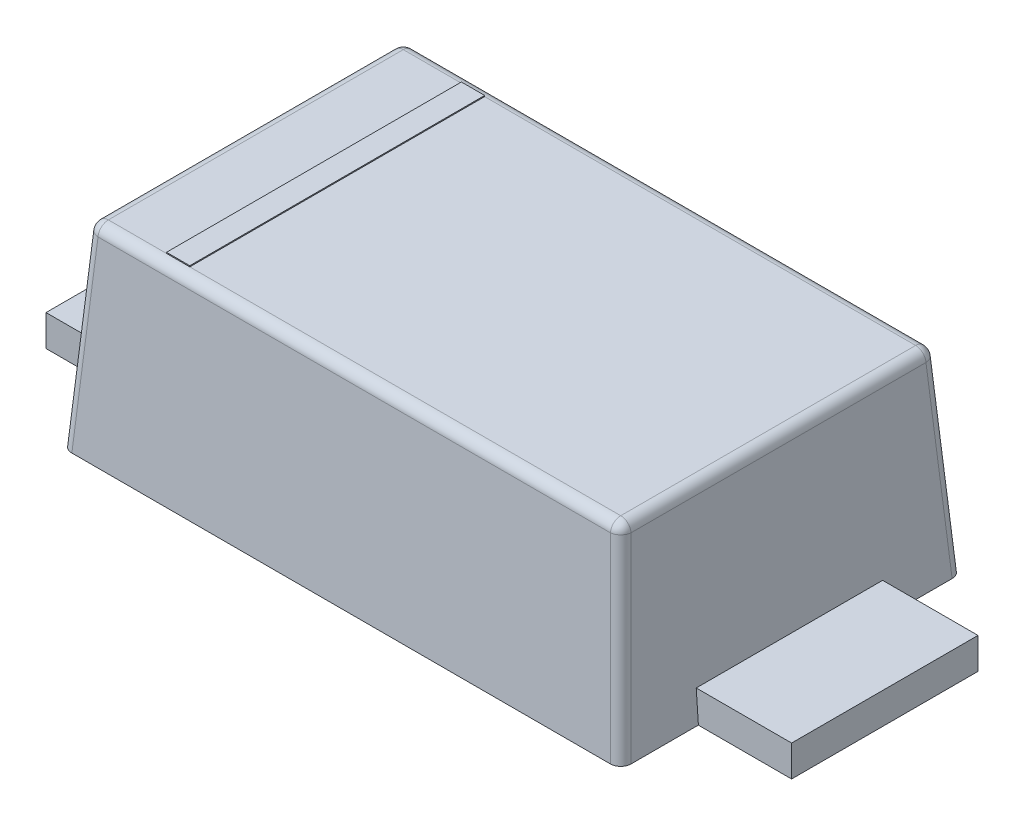
ISO-10303-21;
HEADER;
FILE_DESCRIPTION(('STEP AP214'),'2;1');
FILE_NAME('part.step','',(''),(''),'','','');
FILE_SCHEMA(('AUTOMOTIVE_DESIGN { 1 0 10303 214 1 1 1 1 }'));
ENDSEC;
DATA;
#1=APPLICATION_CONTEXT('core data for automotive mechanical design processes');
#2=APPLICATION_PROTOCOL_DEFINITION('international standard','automotive_design',2000,#1);
#3=PRODUCT_CONTEXT('',#1,'mechanical');
#4=PRODUCT('Part','Part','',(#3));
#5=PRODUCT_RELATED_PRODUCT_CATEGORY('part','',(#4));
#6=PRODUCT_DEFINITION_FORMATION('','',#4);
#7=PRODUCT_DEFINITION_CONTEXT('part definition',#1,'design');
#8=PRODUCT_DEFINITION('design','',#6,#7);
#9=PRODUCT_DEFINITION_SHAPE('','',#8);
#10=(LENGTH_UNIT() NAMED_UNIT(*) SI_UNIT(.MILLI.,.METRE.));
#11=(NAMED_UNIT(*) PLANE_ANGLE_UNIT() SI_UNIT($,.RADIAN.));
#12=(NAMED_UNIT(*) SI_UNIT($,.STERADIAN.) SOLID_ANGLE_UNIT());
#13=UNCERTAINTY_MEASURE_WITH_UNIT(LENGTH_MEASURE(1.E-05),#10,'distance_accuracy_value','');
#14=(GEOMETRIC_REPRESENTATION_CONTEXT(3) GLOBAL_UNCERTAINTY_ASSIGNED_CONTEXT((#13)) GLOBAL_UNIT_ASSIGNED_CONTEXT((#10,
#11,#12)) REPRESENTATION_CONTEXT('',''));
#15=CARTESIAN_POINT('',(0.,0.,0.));
#16=DIRECTION('',(0.,0.,1.));
#17=DIRECTION('',(1.,0.,0.));
#18=AXIS2_PLACEMENT_3D('',#15,#16,#17);
#19=CARTESIAN_POINT('',(0.,0.,0.));
#20=DIRECTION('',(0.,-1.,0.));
#21=DIRECTION('',(0.,0.,-1.));
#22=AXIS2_PLACEMENT_3D('',#19,#20,#21);
#23=PLANE('',#22);
#24=DIRECTION('',(0.,0.,-1.));
#25=VECTOR('',#24,1.);
#26=CARTESIAN_POINT('',(1.05,0.,-0.45));
#27=LINE('',#26,#25);
#28=CARTESIAN_POINT('',(1.05,0.,0.45));
#29=VERTEX_POINT('',#28);
#30=CARTESIAN_POINT('',(1.05,0.,-0.45));
#31=VERTEX_POINT('',#30);
#32=EDGE_CURVE('E56',#29,#31,#27,.T.);
#33=ORIENTED_EDGE('',*,*,#32,.F.);
#34=DIRECTION('',(-1.,0.,0.));
#35=VECTOR('',#34,1.);
#36=CARTESIAN_POINT('',(1.05,0.,0.45));
#37=LINE('',#36,#35);
#38=CARTESIAN_POINT('',(1.35000000000001,0.,0.45));
#39=VERTEX_POINT('',#38);
#40=EDGE_CURVE('E252',#39,#29,#37,.T.);
#41=ORIENTED_EDGE('',*,*,#40,.F.);
#42=DIRECTION('',(0.,0.,-1.));
#43=VECTOR('',#42,1.);
#44=CARTESIAN_POINT('',(1.35000000000001,0.,0.824999999999999));
#45=LINE('',#44,#43);
#46=CARTESIAN_POINT('',(1.35000000000001,0.,0.775121797487008));
#47=VERTEX_POINT('',#46);
#48=EDGE_CURVE('E389',#47,#39,#45,.T.);
#49=ORIENTED_EDGE('',*,*,#48,.F.);
#50=CARTESIAN_POINT('',(1.29987790509595,0.,0.774877905095941));
#51=DIRECTION('',(0.,-1.,0.));
#52=DIRECTION('',(0.707106781186548,0.,0.707106781186548));
#53=AXIS2_PLACEMENT_3D('',#50,#51,#52);
#54=ELLIPSE('',#53,0.0502438931129238,0.05);
#55=CARTESIAN_POINT('',(1.30012179748702,0.,0.824999999999999));
#56=VERTEX_POINT('',#55);
#57=EDGE_CURVE('E411',#47,#56,#54,.T.);
#58=ORIENTED_EDGE('',*,*,#57,.T.);
#59=DIRECTION('',(1.,0.,0.));
#60=VECTOR('',#59,1.);
#61=CARTESIAN_POINT('',(-1.35,0.,0.824999999999999));
#62=LINE('',#61,#60);
#63=CARTESIAN_POINT('',(-1.30012179748701,0.,0.824999999999999));
#64=VERTEX_POINT('',#63);
#65=EDGE_CURVE('E393',#64,#56,#62,.T.);
#66=ORIENTED_EDGE('',*,*,#65,.F.);
#67=CARTESIAN_POINT('',(-1.29987790509595,0.,0.774877905095941));
#68=DIRECTION('',(0.,-1.,0.));
#69=DIRECTION('',(-0.707106781186548,0.,0.707106781186548));
#70=AXIS2_PLACEMENT_3D('',#67,#68,#69);
#71=ELLIPSE('',#70,0.0502438931129238,0.05);
#72=CARTESIAN_POINT('',(-1.35,0.,0.775121797487008));
#73=VERTEX_POINT('',#72);
#74=EDGE_CURVE('E414',#64,#73,#71,.T.);
#75=ORIENTED_EDGE('',*,*,#74,.T.);
#76=DIRECTION('',(0.,0.,-1.));
#77=VECTOR('',#76,1.);
#78=CARTESIAN_POINT('',(-1.35,0.,0.824999999999999));
#79=LINE('',#78,#77);
#80=CARTESIAN_POINT('',(-1.35,0.,0.45));
#81=VERTEX_POINT('',#80);
#82=EDGE_CURVE('E379',#73,#81,#79,.T.);
#83=ORIENTED_EDGE('',*,*,#82,.T.);
#84=DIRECTION('',(-1.,0.,0.));
#85=VECTOR('',#84,1.);
#86=CARTESIAN_POINT('',(-1.05,0.,0.45));
#87=LINE('',#86,#85);
#88=CARTESIAN_POINT('',(-1.05,0.,0.45));
#89=VERTEX_POINT('',#88);
#90=EDGE_CURVE('E268',#89,#81,#87,.T.);
#91=ORIENTED_EDGE('',*,*,#90,.F.);
#92=DIRECTION('',(0.,0.,1.));
#93=VECTOR('',#92,1.);
#94=CARTESIAN_POINT('',(-1.05,0.,-0.45));
#95=LINE('',#94,#93);
#96=CARTESIAN_POINT('',(-1.05,0.,-0.45));
#97=VERTEX_POINT('',#96);
#98=EDGE_CURVE('E262',#97,#89,#95,.T.);
#99=ORIENTED_EDGE('',*,*,#98,.F.);
#100=DIRECTION('',(1.,0.,0.));
#101=VECTOR('',#100,1.);
#102=CARTESIAN_POINT('',(-1.05,0.,-0.45));
#103=LINE('',#102,#101);
#104=CARTESIAN_POINT('',(-1.35,0.,-0.45));
#105=VERTEX_POINT('',#104);
#106=EDGE_CURVE('E11',#105,#97,#103,.T.);
#107=ORIENTED_EDGE('',*,*,#106,.F.);
#108=CARTESIAN_POINT('',(-1.35,0.,-0.775121797487001));
#109=VERTEX_POINT('',#108);
#110=EDGE_CURVE('E384',#105,#109,#79,.T.);
#111=ORIENTED_EDGE('',*,*,#110,.T.);
#112=CARTESIAN_POINT('',(-1.29987790509595,0.,-0.774877905095934));
#113=DIRECTION('',(0.,-1.,0.));
#114=DIRECTION('',(-0.707106781186548,0.,-0.707106781186548));
#115=AXIS2_PLACEMENT_3D('',#112,#113,#114);
#116=ELLIPSE('',#115,0.0502438931129238,0.05);
#117=CARTESIAN_POINT('',(-1.30012179748701,0.,-0.824999999999992));
#118=VERTEX_POINT('',#117);
#119=EDGE_CURVE('E417',#109,#118,#116,.T.);
#120=ORIENTED_EDGE('',*,*,#119,.T.);
#121=DIRECTION('',(1.,0.,0.));
#122=VECTOR('',#121,1.);
#123=CARTESIAN_POINT('',(-1.35,0.,-0.824999999999992));
#124=LINE('',#123,#122);
#125=CARTESIAN_POINT('',(1.30012179748702,0.,-0.824999999999992));
#126=VERTEX_POINT('',#125);
#127=EDGE_CURVE('E383',#118,#126,#124,.T.);
#128=ORIENTED_EDGE('',*,*,#127,.T.);
#129=CARTESIAN_POINT('',(1.29987790509595,0.,-0.774877905095934));
#130=DIRECTION('',(0.,-1.,0.));
#131=DIRECTION('',(0.707106781186548,0.,-0.707106781186548));
#132=AXIS2_PLACEMENT_3D('',#129,#130,#131);
#133=ELLIPSE('',#132,0.0502438931129238,0.05);
#134=CARTESIAN_POINT('',(1.35000000000001,0.,-0.775121797487001));
#135=VERTEX_POINT('',#134);
#136=EDGE_CURVE('E407',#126,#135,#133,.T.);
#137=ORIENTED_EDGE('',*,*,#136,.T.);
#138=CARTESIAN_POINT('',(1.35000000000001,0.,-0.45));
#139=VERTEX_POINT('',#138);
#140=EDGE_CURVE('E388',#139,#135,#45,.T.);
#141=ORIENTED_EDGE('',*,*,#140,.F.);
#142=DIRECTION('',(1.,0.,0.));
#143=VECTOR('',#142,1.);
#144=CARTESIAN_POINT('',(1.05,0.,-0.45));
#145=LINE('',#144,#143);
#146=EDGE_CURVE('E61',#31,#139,#145,.T.);
#147=ORIENTED_EDGE('',*,*,#146,.F.);
#148=EDGE_LOOP('',(#33,#41,#49,#58,#66,#75,#83,#91,#99,#107,#111,#120,#128,#137,#141,#147));
#149=FACE_BOUND('',#148,.T.);
#150=ADVANCED_FACE('F39',(#149),#23,.T.);
#151=CARTESIAN_POINT('',(0.,0.95,0.));
#152=DIRECTION('',(0.,-1.,0.));
#153=DIRECTION('',(0.,0.,-1.));
#154=AXIS2_PLACEMENT_3D('',#151,#152,#153);
#155=PLANE('',#154);
#156=DIRECTION('',(0.,0.,-1.));
#157=VECTOR('',#156,1.);
#158=CARTESIAN_POINT('',(-0.843818655356338,0.95,0.711943774346774));
#159=LINE('',#158,#157);
#160=CARTESIAN_POINT('',(-0.843818655356338,0.95,0.711943774346781));
#161=VERTEX_POINT('',#160);
#162=CARTESIAN_POINT('',(-0.843818655356338,0.95,-0.711943774346774));
#163=VERTEX_POINT('',#162);
#164=EDGE_CURVE('E299',#161,#163,#159,.T.);
#165=ORIENTED_EDGE('',*,*,#164,.F.);
#166=DIRECTION('',(-1.,0.,0.));
#167=VECTOR('',#166,1.);
#168=CARTESIAN_POINT('',(0.,0.95,0.711943774346781));
#169=LINE('',#168,#167);
#170=CARTESIAN_POINT('',(1.23694377434679,0.95,0.711943774346781));
#171=VERTEX_POINT('',#170);
#172=EDGE_CURVE('E450',#161,#171,#169,.F.);
#173=ORIENTED_EDGE('',*,*,#172,.T.);
#174=DIRECTION('',(0.,0.,1.));
#175=VECTOR('',#174,1.);
#176=CARTESIAN_POINT('',(1.23694377434679,0.95,0.));
#177=LINE('',#176,#175);
#178=CARTESIAN_POINT('',(1.23694377434679,0.95,-0.711943774346774));
#179=VERTEX_POINT('',#178);
#180=EDGE_CURVE('E455',#171,#179,#177,.F.);
#181=ORIENTED_EDGE('',*,*,#180,.T.);
#182=DIRECTION('',(1.,0.,0.));
#183=VECTOR('',#182,1.);
#184=CARTESIAN_POINT('',(-1.28356952865367,0.95,-0.711943774346774));
#185=LINE('',#184,#183);
#186=EDGE_CURVE('E459',#179,#163,#185,.F.);
#187=ORIENTED_EDGE('',*,*,#186,.T.);
#188=EDGE_LOOP('',(#165,#173,#181,#187));
#189=FACE_BOUND('',#188,.T.);
#190=ADVANCED_FACE('F541',(#189),#155,.F.);
#191=CARTESIAN_POINT('',(-1.35,0.,0.824999999999999));
#192=DIRECTION('',(-0.997564050259824,0.0697564737441255,0.));
#193=DIRECTION('',(-0.0697564737441255,-0.997564050259824,0.));
#194=AXIS2_PLACEMENT_3D('',#191,#192,#193);
#195=PLANE('',#194);
#196=DIRECTION('',(-0.0697564737441255,-0.997564050259824,0.));
#197=VECTOR('',#196,1.);
#198=CARTESIAN_POINT('',(-1.35,0.,-0.45));
#199=LINE('',#198,#197);
#200=CARTESIAN_POINT('',(-1.33951097820848,0.15,-0.45));
#201=VERTEX_POINT('',#200);
#202=EDGE_CURVE('E374',#201,#105,#199,.T.);
#203=ORIENTED_EDGE('',*,*,#202,.F.);
#204=DIRECTION('',(0.,0.,-1.));
#205=VECTOR('',#204,1.);
#206=CARTESIAN_POINT('',(-1.33951097820848,0.15,0.824999999999999));
#207=LINE('',#206,#205);
#208=CARTESIAN_POINT('',(-1.33951097820848,0.15,0.45));
#209=VERTEX_POINT('',#208);
#210=EDGE_CURVE('E463',#209,#201,#207,.T.);
#211=ORIENTED_EDGE('',*,*,#210,.F.);
#212=DIRECTION('',(0.0697564737441255,0.997564050259824,0.));
#213=VECTOR('',#212,1.);
#214=CARTESIAN_POINT('',(-1.35,0.,0.45));
#215=LINE('',#214,#213);
#216=EDGE_CURVE('E369',#81,#209,#215,.T.);
#217=ORIENTED_EDGE('',*,*,#216,.F.);
#218=ORIENTED_EDGE('',*,*,#82,.F.);
#219=DIRECTION('',(0.0695873743166648,0.995145815783509,-0.0695873743166648));
#220=VECTOR('',#219,1.);
#221=CARTESIAN_POINT('',(-1.28381105899441,0.946545955206224,0.708932856481412));
#222=LINE('',#221,#220);
#223=CARTESIAN_POINT('',(-1.28682197685978,0.903487823687206,0.711943774346781));
#224=VERTEX_POINT('',#223);
#225=EDGE_CURVE('E400',#73,#224,#222,.T.);
#226=ORIENTED_EDGE('',*,*,#225,.T.);
#227=DIRECTION('',(0.,0.,-1.));
#228=VECTOR('',#227,1.);
#229=CARTESIAN_POINT('',(-1.28682197685978,0.903487823687206,-0.758569528653657));
#230=LINE('',#229,#228);
#231=CARTESIAN_POINT('',(-1.28682197685978,0.903487823687206,-0.711943774346774));
#232=VERTEX_POINT('',#231);
#233=EDGE_CURVE('E397',#224,#232,#230,.T.);
#234=ORIENTED_EDGE('',*,*,#233,.T.);
#235=DIRECTION('',(-0.0695873743166648,-0.995145815783509,-0.0695873743166648));
#236=VECTOR('',#235,1.);
#237=CARTESIAN_POINT('',(-1.34225156594467,0.110807769437497,-0.767373363431665));
#238=LINE('',#237,#236);
#239=EDGE_CURVE('E403',#232,#109,#238,.T.);
#240=ORIENTED_EDGE('',*,*,#239,.T.);
#241=ORIENTED_EDGE('',*,*,#110,.F.);
#242=EDGE_LOOP('',(#203,#211,#217,#218,#226,#234,#240,#241));
#243=FACE_BOUND('',#242,.T.);
#244=ADVANCED_FACE('F546',(#243),#195,.T.);
#245=CARTESIAN_POINT('',(-1.35,0.,0.824999999999999));
#246=DIRECTION('',(0.,0.0697564737441255,0.997564050259824));
#247=DIRECTION('',(0.,-0.997564050259824,0.0697564737441255));
#248=AXIS2_PLACEMENT_3D('',#245,#246,#247);
#249=PLANE('',#248);
#250=DIRECTION('',(1.,0.,0.));
#251=VECTOR('',#250,1.);
#252=CARTESIAN_POINT('',(-1.35,0.903487823687206,0.761821976859772));
#253=LINE('',#252,#251);
#254=CARTESIAN_POINT('',(1.23694377434679,0.903487823687206,0.761821976859772));
#255=VERTEX_POINT('',#254);
#256=CARTESIAN_POINT('',(-1.23694377434679,0.903487823687206,0.761821976859772));
#257=VERTEX_POINT('',#256);
#258=EDGE_CURVE('E429',#255,#257,#253,.F.);
#259=ORIENTED_EDGE('',*,*,#258,.T.);
#260=DIRECTION('',(-0.0695873743166648,-0.995145815783509,0.0695873743166648));
#261=VECTOR('',#260,1.);
#262=CARTESIAN_POINT('',(-1.30036332782775,-0.00345404479377528,0.825241530340738));
#263=LINE('',#262,#261);
#264=EDGE_CURVE('E435',#257,#64,#263,.T.);
#265=ORIENTED_EDGE('',*,*,#264,.T.);
#266=ORIENTED_EDGE('',*,*,#65,.T.);
#267=DIRECTION('',(-0.0695873743166648,0.995145815783509,-0.0695873743166648));
#268=VECTOR('',#267,1.);
#269=CARTESIAN_POINT('',(1.28728884063418,0.183519833039218,0.812167043147161));
#270=LINE('',#269,#268);
#271=EDGE_CURVE('E432',#56,#255,#270,.T.);
#272=ORIENTED_EDGE('',*,*,#271,.T.);
#273=EDGE_LOOP('',(#259,#265,#266,#272));
#274=FACE_BOUND('',#273,.T.);
#275=ADVANCED_FACE('F554',(#274),#249,.T.);
#276=CARTESIAN_POINT('',(1.35000000000001,0.,0.824999999999999));
#277=DIRECTION('',(0.997564050259824,0.0697564737441255,0.));
#278=DIRECTION('',(-0.0697564737441255,0.997564050259824,0.));
#279=AXIS2_PLACEMENT_3D('',#276,#277,#278);
#280=PLANE('',#279);
#281=DIRECTION('',(0.,0.,1.));
#282=VECTOR('',#281,1.);
#283=CARTESIAN_POINT('',(1.33951097820848,0.15,0.824999999999999));
#284=LINE('',#283,#282);
#285=CARTESIAN_POINT('',(1.33951097820848,0.15,0.45));
#286=VERTEX_POINT('',#285);
#287=CARTESIAN_POINT('',(1.33951097820848,0.15,-0.45));
#288=VERTEX_POINT('',#287);
#289=EDGE_CURVE('E43',#286,#288,#284,.F.);
#290=ORIENTED_EDGE('',*,*,#289,.T.);
#291=DIRECTION('',(-0.0697564737441255,0.997564050259824,0.));
#292=VECTOR('',#291,1.);
#293=CARTESIAN_POINT('',(1.35000000000001,0.,-0.45));
#294=LINE('',#293,#292);
#295=EDGE_CURVE('E350',#288,#139,#294,.F.);
#296=ORIENTED_EDGE('',*,*,#295,.T.);
#297=ORIENTED_EDGE('',*,*,#140,.T.);
#298=DIRECTION('',(0.0695873743166648,-0.995145815783509,-0.0695873743166648));
#299=VECTOR('',#298,1.);
#300=CARTESIAN_POINT('',(1.28381105899441,0.946545955206225,-0.708932856481405));
#301=LINE('',#300,#299);
#302=CARTESIAN_POINT('',(1.28682197685978,0.903487823687206,-0.711943774346774));
#303=VERTEX_POINT('',#302);
#304=EDGE_CURVE('E441',#135,#303,#301,.F.);
#305=ORIENTED_EDGE('',*,*,#304,.T.);
#306=DIRECTION('',(0.,0.,-1.));
#307=VECTOR('',#306,1.);
#308=CARTESIAN_POINT('',(1.28682197685978,0.903487823687206,0.824999999999999));
#309=LINE('',#308,#307);
#310=CARTESIAN_POINT('',(1.28682197685978,0.903487823687206,0.711943774346781));
#311=VERTEX_POINT('',#310);
#312=EDGE_CURVE('E438',#303,#311,#309,.F.);
#313=ORIENTED_EDGE('',*,*,#312,.T.);
#314=DIRECTION('',(-0.0695873743166648,0.995145815783509,-0.0695873743166648));
#315=VECTOR('',#314,1.);
#316=CARTESIAN_POINT('',(1.35024153034075,-0.00345404479377529,0.775363327827747));
#317=LINE('',#316,#315);
#318=EDGE_CURVE('E444',#311,#47,#317,.F.);
#319=ORIENTED_EDGE('',*,*,#318,.T.);
#320=ORIENTED_EDGE('',*,*,#48,.T.);
#321=DIRECTION('',(0.0697564737441255,-0.997564050259824,0.));
#322=VECTOR('',#321,1.);
#323=CARTESIAN_POINT('',(1.35000000000001,0.,0.45));
#324=LINE('',#323,#322);
#325=EDGE_CURVE('E346',#39,#286,#324,.F.);
#326=ORIENTED_EDGE('',*,*,#325,.T.);
#327=EDGE_LOOP('',(#290,#296,#297,#305,#313,#319,#320,#326));
#328=FACE_BOUND('',#327,.T.);
#329=ADVANCED_FACE('F519',(#328),#280,.T.);
#330=CARTESIAN_POINT('',(-1.35,0.,-0.824999999999992));
#331=DIRECTION('',(0.,0.0697564737441255,-0.997564050259824));
#332=DIRECTION('',(0.,0.997564050259824,0.0697564737441255));
#333=AXIS2_PLACEMENT_3D('',#330,#331,#332);
#334=PLANE('',#333);
#335=ORIENTED_EDGE('',*,*,#127,.F.);
#336=DIRECTION('',(-0.0695873743166648,-0.995145815783509,-0.0695873743166648));
#337=VECTOR('',#336,1.);
#338=CARTESIAN_POINT('',(-1.30036332782775,-0.00345404479377529,-0.825241530340731));
#339=LINE('',#338,#337);
#340=CARTESIAN_POINT('',(-1.23694377434679,0.903487823687206,-0.761821976859765));
#341=VERTEX_POINT('',#340);
#342=EDGE_CURVE('E426',#118,#341,#339,.F.);
#343=ORIENTED_EDGE('',*,*,#342,.T.);
#344=DIRECTION('',(1.,0.,0.));
#345=VECTOR('',#344,1.);
#346=CARTESIAN_POINT('',(1.28356952865367,0.903487823687206,-0.761821976859765));
#347=LINE('',#346,#345);
#348=CARTESIAN_POINT('',(1.23694377434679,0.903487823687206,-0.761821976859765));
#349=VERTEX_POINT('',#348);
#350=EDGE_CURVE('E420',#341,#349,#347,.T.);
#351=ORIENTED_EDGE('',*,*,#350,.T.);
#352=DIRECTION('',(-0.0695873743166648,0.995145815783509,0.0695873743166648));
#353=VECTOR('',#352,1.);
#354=CARTESIAN_POINT('',(1.30036332782776,-0.00345404479377525,-0.825241530340731));
#355=LINE('',#354,#353);
#356=EDGE_CURVE('E423',#349,#126,#355,.F.);
#357=ORIENTED_EDGE('',*,*,#356,.T.);
#358=EDGE_LOOP('',(#335,#343,#351,#357));
#359=FACE_BOUND('',#358,.T.);
#360=ADVANCED_FACE('F556',(#359),#334,.T.);
#361=CARTESIAN_POINT('',(-1.23694377434679,0.95,0.711943774346781));
#362=VERTEX_POINT('',#361);
#363=CARTESIAN_POINT('',(-0.956181344643662,0.95,0.711943774346781));
#364=VERTEX_POINT('',#363);
#365=EDGE_CURVE('E451',#362,#364,#169,.F.);
#366=ORIENTED_EDGE('',*,*,#365,.T.);
#367=DIRECTION('',(0.,0.,-1.));
#368=VECTOR('',#367,1.);
#369=CARTESIAN_POINT('',(-0.956181344643662,0.95,0.711943774346774));
#370=LINE('',#369,#368);
#371=CARTESIAN_POINT('',(-0.956181344643662,0.95,-0.711943774346774));
#372=VERTEX_POINT('',#371);
#373=EDGE_CURVE('E312',#364,#372,#370,.T.);
#374=ORIENTED_EDGE('',*,*,#373,.T.);
#375=CARTESIAN_POINT('',(-1.23694377434679,0.95,-0.711943774346774));
#376=VERTEX_POINT('',#375);
#377=EDGE_CURVE('E458',#372,#376,#185,.F.);
#378=ORIENTED_EDGE('',*,*,#377,.T.);
#379=DIRECTION('',(0.,0.,-1.));
#380=VECTOR('',#379,1.);
#381=CARTESIAN_POINT('',(-1.23694377434679,0.95,0.758569528653664));
#382=LINE('',#381,#380);
#383=EDGE_CURVE('E447',#376,#362,#382,.F.);
#384=ORIENTED_EDGE('',*,*,#383,.T.);
#385=EDGE_LOOP('',(#366,#374,#378,#384));
#386=FACE_BOUND('',#385,.T.);
#387=ADVANCED_FACE('F549',(#386),#155,.F.);
#388=CARTESIAN_POINT('',(1.30036332782776,-0.00694186848098156,0.775363327827747));
#389=DIRECTION('',(0.0695873743166648,-0.995145815783508,0.0695873743166648));
#390=DIRECTION('',(0.,-0.0697564737441255,-0.997564050259824));
#391=AXIS2_PLACEMENT_3D('',#388,#389,#390);
#392=CYLINDRICAL_SURFACE('',#391,0.05);
#393=CARTESIAN_POINT('',(1.23694377434679,0.9,0.711943774346781));
#394=DIRECTION('',(-0.0695873743166648,0.995145815783508,-0.0695873743166647));
#395=DIRECTION('',(-0.997564050259824,-0.0697564737441255,0.));
#396=AXIS2_PLACEMENT_3D('',#393,#394,#395);
#397=CIRCLE('',#396,0.05);
#398=EDGE_CURVE('E507',#255,#311,#397,.T.);
#399=ORIENTED_EDGE('',*,*,#398,.F.);
#400=ORIENTED_EDGE('',*,*,#271,.F.);
#401=ORIENTED_EDGE('',*,*,#57,.F.);
#402=ORIENTED_EDGE('',*,*,#318,.F.);
#403=EDGE_LOOP('',(#399,#400,#401,#402));
#404=FACE_BOUND('',#403,.T.);
#405=ADVANCED_FACE('F41',(#404),#392,.T.);
#406=CARTESIAN_POINT('',(1.23694377434679,0.9,0.711943774346781));
#407=DIRECTION('',(0.,0.,1.));
#408=DIRECTION('',(1.,0.,0.));
#409=AXIS2_PLACEMENT_3D('',#406,#407,#408);
#410=SPHERICAL_SURFACE('',#409,0.05);
#411=CARTESIAN_POINT('',(1.23694377434679,0.9,0.711943774346781));
#412=DIRECTION('',(1.,0.,0.));
#413=DIRECTION('',(0.,0.,-1.));
#414=AXIS2_PLACEMENT_3D('',#411,#412,#413);
#415=CIRCLE('',#414,0.05);
#416=EDGE_CURVE('E499',#255,#171,#415,.F.);
#417=ORIENTED_EDGE('',*,*,#416,.F.);
#418=ORIENTED_EDGE('',*,*,#398,.T.);
#419=CARTESIAN_POINT('',(1.23694377434679,0.9,0.711943774346781));
#420=DIRECTION('',(0.,0.,1.));
#421=DIRECTION('',(1.,0.,0.));
#422=AXIS2_PLACEMENT_3D('',#419,#420,#421);
#423=CIRCLE('',#422,0.05);
#424=EDGE_CURVE('E503',#171,#311,#423,.F.);
#425=ORIENTED_EDGE('',*,*,#424,.F.);
#426=EDGE_LOOP('',(#417,#418,#425));
#427=FACE_BOUND('',#426,.T.);
#428=ADVANCED_FACE('F604',(#427),#410,.T.);
#429=CARTESIAN_POINT('',(1.28728884063418,0.180032009352012,-0.762288840634163));
#430=DIRECTION('',(0.0695873743166648,-0.995145815783508,-0.0695873743166648));
#431=DIRECTION('',(0.,0.0697564737441255,-0.997564050259824));
#432=AXIS2_PLACEMENT_3D('',#429,#430,#431);
#433=CYLINDRICAL_SURFACE('',#432,0.05);
#434=ORIENTED_EDGE('',*,*,#136,.F.);
#435=ORIENTED_EDGE('',*,*,#356,.F.);
#436=CARTESIAN_POINT('',(1.23694377434679,0.9,-0.711943774346774));
#437=DIRECTION('',(-0.0695873743166648,0.995145815783508,0.0695873743166644));
#438=DIRECTION('',(-0.997564050259824,-0.0697564737441255,0.));
#439=AXIS2_PLACEMENT_3D('',#436,#437,#438);
#440=CIRCLE('',#439,0.05);
#441=EDGE_CURVE('E495',#303,#349,#440,.T.);
#442=ORIENTED_EDGE('',*,*,#441,.F.);
#443=ORIENTED_EDGE('',*,*,#304,.F.);
#444=EDGE_LOOP('',(#434,#435,#442,#443));
#445=FACE_BOUND('',#444,.T.);
#446=ADVANCED_FACE('F601',(#445),#433,.T.);
#447=CARTESIAN_POINT('',(1.23694377434679,0.9,0.));
#448=DIRECTION('',(0.,0.,1.));
#449=DIRECTION('',(1.,0.,0.));
#450=AXIS2_PLACEMENT_3D('',#447,#448,#449);
#451=CYLINDRICAL_SURFACE('',#450,0.05);
#452=ORIENTED_EDGE('',*,*,#424,.T.);
#453=ORIENTED_EDGE('',*,*,#312,.F.);
#454=CARTESIAN_POINT('',(1.23694377434679,0.9,-0.711943774346774));
#455=DIRECTION('',(0.,0.,-1.));
#456=DIRECTION('',(-1.,0.,0.));
#457=AXIS2_PLACEMENT_3D('',#454,#455,#456);
#458=CIRCLE('',#457,0.05);
#459=EDGE_CURVE('E491',#179,#303,#458,.T.);
#460=ORIENTED_EDGE('',*,*,#459,.F.);
#461=ORIENTED_EDGE('',*,*,#180,.F.);
#462=EDGE_LOOP('',(#452,#453,#460,#461));
#463=FACE_BOUND('',#462,.T.);
#464=ADVANCED_FACE('F597',(#463),#451,.T.);
#465=CARTESIAN_POINT('',(0.,0.9,0.711943774346781));
#466=DIRECTION('',(-1.,0.,0.));
#467=DIRECTION('',(0.,0.,1.));
#468=AXIS2_PLACEMENT_3D('',#465,#466,#467);
#469=CYLINDRICAL_SURFACE('',#468,0.05);
#470=ORIENTED_EDGE('',*,*,#416,.T.);
#471=ORIENTED_EDGE('',*,*,#172,.F.);
#472=DIRECTION('',(-1.,0.,0.));
#473=VECTOR('',#472,1.);
#474=CARTESIAN_POINT('',(-0.843818655356338,0.95,0.711943774346774));
#475=LINE('',#474,#473);
#476=EDGE_CURVE('E293',#161,#364,#475,.T.);
#477=ORIENTED_EDGE('',*,*,#476,.T.);
#478=ORIENTED_EDGE('',*,*,#365,.F.);
#479=CARTESIAN_POINT('',(-1.23694377434679,0.9,0.711943774346781));
#480=DIRECTION('',(-1.,0.,0.));
#481=DIRECTION('',(0.,0.,1.));
#482=AXIS2_PLACEMENT_3D('',#479,#480,#481);
#483=CIRCLE('',#482,0.05);
#484=EDGE_CURVE('E487',#257,#362,#483,.T.);
#485=ORIENTED_EDGE('',*,*,#484,.F.);
#486=ORIENTED_EDGE('',*,*,#258,.F.);
#487=EDGE_LOOP('',(#470,#471,#477,#478,#485,#486));
#488=FACE_BOUND('',#487,.T.);
#489=ADVANCED_FACE('F593',(#488),#469,.T.);
#490=CARTESIAN_POINT('',(-1.30036332782775,-0.00694186848098155,0.775363327827747));
#491=DIRECTION('',(-0.0695873743166648,-0.995145815783508,0.0695873743166648));
#492=DIRECTION('',(0.,-0.0697564737441255,-0.997564050259824));
#493=AXIS2_PLACEMENT_3D('',#490,#491,#492);
#494=CYLINDRICAL_SURFACE('',#493,0.05);
#495=ORIENTED_EDGE('',*,*,#74,.F.);
#496=ORIENTED_EDGE('',*,*,#264,.F.);
#497=CARTESIAN_POINT('',(-1.23694377434679,0.9,0.711943774346781));
#498=DIRECTION('',(0.0695873743166648,0.995145815783508,-0.0695873743166647));
#499=DIRECTION('',(-0.997564050259824,0.0697564737441255,0.));
#500=AXIS2_PLACEMENT_3D('',#497,#498,#499);
#501=CIRCLE('',#500,0.05);
#502=EDGE_CURVE('E483',#224,#257,#501,.T.);
#503=ORIENTED_EDGE('',*,*,#502,.F.);
#504=ORIENTED_EDGE('',*,*,#225,.F.);
#505=EDGE_LOOP('',(#495,#496,#503,#504));
#506=FACE_BOUND('',#505,.T.);
#507=ADVANCED_FACE('F589',(#506),#494,.T.);
#508=CARTESIAN_POINT('',(1.23694377434679,0.9,-0.711943774346774));
#509=DIRECTION('',(0.,0.,1.));
#510=DIRECTION('',(1.,0.,0.));
#511=AXIS2_PLACEMENT_3D('',#508,#509,#510);
#512=SPHERICAL_SURFACE('',#511,0.05);
#513=ORIENTED_EDGE('',*,*,#459,.T.);
#514=ORIENTED_EDGE('',*,*,#441,.T.);
#515=CARTESIAN_POINT('',(1.23694377434679,0.9,-0.711943774346774));
#516=DIRECTION('',(1.,0.,0.));
#517=DIRECTION('',(0.,1.,0.));
#518=AXIS2_PLACEMENT_3D('',#515,#516,#517);
#519=CIRCLE('',#518,0.05);
#520=EDGE_CURVE('E479',#179,#349,#519,.F.);
#521=ORIENTED_EDGE('',*,*,#520,.F.);
#522=EDGE_LOOP('',(#513,#514,#521));
#523=FACE_BOUND('',#522,.T.);
#524=ADVANCED_FACE('F585',(#523),#512,.T.);
#525=CARTESIAN_POINT('',(-1.23694377434679,0.9,0.711943774346781));
#526=DIRECTION('',(0.,0.,1.));
#527=DIRECTION('',(1.,0.,0.));
#528=AXIS2_PLACEMENT_3D('',#525,#526,#527);
#529=SPHERICAL_SURFACE('',#528,0.05);
#530=ORIENTED_EDGE('',*,*,#502,.T.);
#531=ORIENTED_EDGE('',*,*,#484,.T.);
#532=CARTESIAN_POINT('',(-1.23694377434679,0.9,0.711943774346781));
#533=DIRECTION('',(0.,0.,1.));
#534=DIRECTION('',(1.,0.,0.));
#535=AXIS2_PLACEMENT_3D('',#532,#533,#534);
#536=CIRCLE('',#535,0.05);
#537=EDGE_CURVE('E475',#224,#362,#536,.F.);
#538=ORIENTED_EDGE('',*,*,#537,.F.);
#539=EDGE_LOOP('',(#530,#531,#538));
#540=FACE_BOUND('',#539,.T.);
#541=ADVANCED_FACE('F581',(#540),#529,.T.);
#542=CARTESIAN_POINT('',(-1.35,0.9,-0.711943774346774));
#543=DIRECTION('',(-1.,0.,0.));
#544=DIRECTION('',(0.,0.,1.));
#545=AXIS2_PLACEMENT_3D('',#542,#543,#544);
#546=CYLINDRICAL_SURFACE('',#545,0.05);
#547=ORIENTED_EDGE('',*,*,#520,.T.);
#548=ORIENTED_EDGE('',*,*,#350,.F.);
#549=CARTESIAN_POINT('',(-1.23694377434679,0.9,-0.711943774346774));
#550=DIRECTION('',(-1.,0.,0.));
#551=DIRECTION('',(0.,0.,1.));
#552=AXIS2_PLACEMENT_3D('',#549,#550,#551);
#553=CIRCLE('',#552,0.05);
#554=EDGE_CURVE('E471',#376,#341,#553,.T.);
#555=ORIENTED_EDGE('',*,*,#554,.F.);
#556=ORIENTED_EDGE('',*,*,#377,.F.);
#557=DIRECTION('',(-1.,0.,0.));
#558=VECTOR('',#557,1.);
#559=CARTESIAN_POINT('',(-0.843818655356338,0.95,-0.711943774346774));
#560=LINE('',#559,#558);
#561=EDGE_CURVE('E316',#163,#372,#560,.T.);
#562=ORIENTED_EDGE('',*,*,#561,.F.);
#563=ORIENTED_EDGE('',*,*,#186,.F.);
#564=EDGE_LOOP('',(#547,#548,#555,#556,#562,#563));
#565=FACE_BOUND('',#564,.T.);
#566=ADVANCED_FACE('F577',(#565),#546,.T.);
#567=CARTESIAN_POINT('',(-1.23694377434679,0.9,0.824999999999999));
#568=DIRECTION('',(0.,0.,1.));
#569=DIRECTION('',(1.,0.,0.));
#570=AXIS2_PLACEMENT_3D('',#567,#568,#569);
#571=CYLINDRICAL_SURFACE('',#570,0.05);
#572=ORIENTED_EDGE('',*,*,#537,.T.);
#573=ORIENTED_EDGE('',*,*,#383,.F.);
#574=CARTESIAN_POINT('',(-1.23694377434679,0.9,-0.711943774346774));
#575=DIRECTION('',(0.,0.,-1.));
#576=DIRECTION('',(-1.,0.,0.));
#577=AXIS2_PLACEMENT_3D('',#574,#575,#576);
#578=CIRCLE('',#577,0.05);
#579=EDGE_CURVE('E467',#232,#376,#578,.T.);
#580=ORIENTED_EDGE('',*,*,#579,.F.);
#581=ORIENTED_EDGE('',*,*,#233,.F.);
#582=EDGE_LOOP('',(#572,#573,#580,#581));
#583=FACE_BOUND('',#582,.T.);
#584=ADVANCED_FACE('F573',(#583),#571,.T.);
#585=CARTESIAN_POINT('',(-1.23694377434679,0.9,-0.711943774346774));
#586=DIRECTION('',(0.,0.,1.));
#587=DIRECTION('',(1.,0.,0.));
#588=AXIS2_PLACEMENT_3D('',#585,#586,#587);
#589=SPHERICAL_SURFACE('',#588,0.05);
#590=ORIENTED_EDGE('',*,*,#579,.T.);
#591=ORIENTED_EDGE('',*,*,#554,.T.);
#592=CARTESIAN_POINT('',(-1.23694377434679,0.9,-0.711943774346774));
#593=DIRECTION('',(0.0695873743166645,0.995145815783509,0.0695873743166647));
#594=DIRECTION('',(0.,-0.0697564737441253,0.997564050259824));
#595=AXIS2_PLACEMENT_3D('',#592,#593,#594);
#596=CIRCLE('',#595,0.05);
#597=EDGE_CURVE('E378',#232,#341,#596,.F.);
#598=ORIENTED_EDGE('',*,*,#597,.F.);
#599=EDGE_LOOP('',(#590,#591,#598));
#600=FACE_BOUND('',#599,.T.);
#601=ADVANCED_FACE('F569',(#600),#589,.T.);
#602=CARTESIAN_POINT('',(-1.29237336343168,0.107319945750291,-0.767373363431665));
#603=DIRECTION('',(-0.0695873743166648,-0.995145815783508,-0.0695873743166648));
#604=DIRECTION('',(0.,0.0697564737441255,-0.997564050259824));
#605=AXIS2_PLACEMENT_3D('',#602,#603,#604);
#606=CYLINDRICAL_SURFACE('',#605,0.05);
#607=ORIENTED_EDGE('',*,*,#597,.T.);
#608=ORIENTED_EDGE('',*,*,#342,.F.);
#609=ORIENTED_EDGE('',*,*,#119,.F.);
#610=ORIENTED_EDGE('',*,*,#239,.F.);
#611=EDGE_LOOP('',(#607,#608,#609,#610));
#612=FACE_BOUND('',#611,.T.);
#613=ADVANCED_FACE('F565',(#612),#606,.T.);
#614=CARTESIAN_POINT('',(-1.05,0.15,-0.45));
#615=DIRECTION('',(0.,0.,-1.));
#616=DIRECTION('',(-1.,0.,0.));
#617=AXIS2_PLACEMENT_3D('',#614,#615,#616);
#618=PLANE('',#617);
#619=DIRECTION('',(1.,0.,0.));
#620=VECTOR('',#619,1.);
#621=CARTESIAN_POINT('',(-1.05,0.15,-0.45));
#622=LINE('',#621,#620);
#623=CARTESIAN_POINT('',(-1.8,0.15,-0.45));
#624=VERTEX_POINT('',#623);
#625=EDGE_CURVE('E354',#624,#201,#622,.T.);
#626=ORIENTED_EDGE('',*,*,#625,.T.);
#627=ORIENTED_EDGE('',*,*,#202,.T.);
#628=ORIENTED_EDGE('',*,*,#106,.T.);
#629=DIRECTION('',(0.,1.,0.));
#630=VECTOR('',#629,1.);
#631=CARTESIAN_POINT('',(-1.05,-0.0005,-0.45));
#632=LINE('',#631,#630);
#633=CARTESIAN_POINT('',(-1.05,-0.0005,-0.45));
#634=VERTEX_POINT('',#633);
#635=EDGE_CURVE('E289',#634,#97,#632,.T.);
#636=ORIENTED_EDGE('',*,*,#635,.F.);
#637=DIRECTION('',(1.,0.,0.));
#638=VECTOR('',#637,1.);
#639=CARTESIAN_POINT('',(-1.05,-0.0005,-0.45));
#640=LINE('',#639,#638);
#641=CARTESIAN_POINT('',(-1.8,-0.0005,-0.45));
#642=VERTEX_POINT('',#641);
#643=EDGE_CURVE('E263',#642,#634,#640,.T.);
#644=ORIENTED_EDGE('',*,*,#643,.F.);
#645=DIRECTION('',(0.,-1.,0.));
#646=VECTOR('',#645,1.);
#647=CARTESIAN_POINT('',(-1.8,0.15,-0.45));
#648=LINE('',#647,#646);
#649=EDGE_CURVE('E366',#624,#642,#648,.T.);
#650=ORIENTED_EDGE('',*,*,#649,.F.);
#651=EDGE_LOOP('',(#626,#627,#628,#636,#644,#650));
#652=FACE_BOUND('',#651,.T.);
#653=ADVANCED_FACE('F568',(#652),#618,.T.);
#654=CARTESIAN_POINT('',(-1.8,0.15,-0.45));
#655=DIRECTION('',(-1.,0.,0.));
#656=DIRECTION('',(0.,0.,1.));
#657=AXIS2_PLACEMENT_3D('',#654,#655,#656);
#658=PLANE('',#657);
#659=ORIENTED_EDGE('',*,*,#649,.T.);
#660=DIRECTION('',(0.,0.,-1.));
#661=VECTOR('',#660,1.);
#662=CARTESIAN_POINT('',(-1.8,-0.0005,-0.45));
#663=LINE('',#662,#661);
#664=CARTESIAN_POINT('',(-1.8,-0.0005,0.45));
#665=VERTEX_POINT('',#664);
#666=EDGE_CURVE('E275',#665,#642,#663,.T.);
#667=ORIENTED_EDGE('',*,*,#666,.F.);
#668=DIRECTION('',(0.,-1.,0.));
#669=VECTOR('',#668,1.);
#670=CARTESIAN_POINT('',(-1.8,0.15,0.45));
#671=LINE('',#670,#669);
#672=CARTESIAN_POINT('',(-1.8,0.15,0.45));
#673=VERTEX_POINT('',#672);
#674=EDGE_CURVE('E365',#673,#665,#671,.T.);
#675=ORIENTED_EDGE('',*,*,#674,.F.);
#676=DIRECTION('',(0.,0.,-1.));
#677=VECTOR('',#676,1.);
#678=CARTESIAN_POINT('',(-1.8,0.15,-0.45));
#679=LINE('',#678,#677);
#680=EDGE_CURVE('E361',#673,#624,#679,.T.);
#681=ORIENTED_EDGE('',*,*,#680,.T.);
#682=EDGE_LOOP('',(#659,#667,#675,#681));
#683=FACE_BOUND('',#682,.T.);
#684=ADVANCED_FACE('F635',(#683),#658,.T.);
#685=CARTESIAN_POINT('',(-1.05,0.15,0.45));
#686=DIRECTION('',(0.,0.,1.));
#687=DIRECTION('',(1.,0.,0.));
#688=AXIS2_PLACEMENT_3D('',#685,#686,#687);
#689=PLANE('',#688);
#690=ORIENTED_EDGE('',*,*,#674,.T.);
#691=DIRECTION('',(-1.,0.,0.));
#692=VECTOR('',#691,1.);
#693=CARTESIAN_POINT('',(-1.05,-0.0005,0.45));
#694=LINE('',#693,#692);
#695=CARTESIAN_POINT('',(-1.05,-0.0005,0.45));
#696=VERTEX_POINT('',#695);
#697=EDGE_CURVE('E271',#696,#665,#694,.T.);
#698=ORIENTED_EDGE('',*,*,#697,.F.);
#699=DIRECTION('',(0.,1.,0.));
#700=VECTOR('',#699,1.);
#701=CARTESIAN_POINT('',(-1.05,-0.0005,0.45));
#702=LINE('',#701,#700);
#703=EDGE_CURVE('E278',#696,#89,#702,.T.);
#704=ORIENTED_EDGE('',*,*,#703,.T.);
#705=ORIENTED_EDGE('',*,*,#90,.T.);
#706=ORIENTED_EDGE('',*,*,#216,.T.);
#707=DIRECTION('',(-1.,0.,0.));
#708=VECTOR('',#707,1.);
#709=CARTESIAN_POINT('',(-1.05,0.15,0.45));
#710=LINE('',#709,#708);
#711=EDGE_CURVE('E358',#209,#673,#710,.T.);
#712=ORIENTED_EDGE('',*,*,#711,.T.);
#713=EDGE_LOOP('',(#690,#698,#704,#705,#706,#712));
#714=FACE_BOUND('',#713,.T.);
#715=ADVANCED_FACE('F630',(#714),#689,.T.);
#716=CARTESIAN_POINT('',(0.,0.15,0.));
#717=DIRECTION('',(0.,1.,0.));
#718=DIRECTION('',(0.,0.,1.));
#719=AXIS2_PLACEMENT_3D('',#716,#717,#718);
#720=PLANE('',#719);
#721=ORIENTED_EDGE('',*,*,#711,.F.);
#722=ORIENTED_EDGE('',*,*,#210,.T.);
#723=ORIENTED_EDGE('',*,*,#625,.F.);
#724=ORIENTED_EDGE('',*,*,#680,.F.);
#725=EDGE_LOOP('',(#721,#722,#723,#724));
#726=FACE_BOUND('',#725,.T.);
#727=ADVANCED_FACE('F633',(#726),#720,.T.);
#728=CARTESIAN_POINT('',(0.,0.15,0.));
#729=DIRECTION('',(0.,1.,0.));
#730=DIRECTION('',(0.,0.,1.));
#731=AXIS2_PLACEMENT_3D('',#728,#729,#730);
#732=PLANE('',#731);
#733=ORIENTED_EDGE('',*,*,#289,.F.);
#734=DIRECTION('',(-1.,0.,0.));
#735=VECTOR('',#734,1.);
#736=CARTESIAN_POINT('',(1.05,0.15,0.45));
#737=LINE('',#736,#735);
#738=CARTESIAN_POINT('',(1.8,0.15,0.45));
#739=VERTEX_POINT('',#738);
#740=EDGE_CURVE('E340',#739,#286,#737,.T.);
#741=ORIENTED_EDGE('',*,*,#740,.F.);
#742=DIRECTION('',(0.,0.,1.));
#743=VECTOR('',#742,1.);
#744=CARTESIAN_POINT('',(1.8,0.15,-0.45));
#745=LINE('',#744,#743);
#746=CARTESIAN_POINT('',(1.8,0.15,-0.45));
#747=VERTEX_POINT('',#746);
#748=EDGE_CURVE('E219',#747,#739,#745,.T.);
#749=ORIENTED_EDGE('',*,*,#748,.F.);
#750=DIRECTION('',(1.,0.,0.));
#751=VECTOR('',#750,1.);
#752=CARTESIAN_POINT('',(1.05,0.15,-0.45));
#753=LINE('',#752,#751);
#754=EDGE_CURVE('E225',#288,#747,#753,.T.);
#755=ORIENTED_EDGE('',*,*,#754,.F.);
#756=EDGE_LOOP('',(#733,#741,#749,#755));
#757=FACE_BOUND('',#756,.T.);
#758=ADVANCED_FACE('F524',(#757),#732,.T.);
#759=CARTESIAN_POINT('',(1.05,0.15,-0.45));
#760=DIRECTION('',(0.,0.,-1.));
#761=DIRECTION('',(-1.,0.,0.));
#762=AXIS2_PLACEMENT_3D('',#759,#760,#761);
#763=PLANE('',#762);
#764=ORIENTED_EDGE('',*,*,#295,.F.);
#765=ORIENTED_EDGE('',*,*,#754,.T.);
#766=DIRECTION('',(0.,-1.,0.));
#767=VECTOR('',#766,1.);
#768=CARTESIAN_POINT('',(1.8,0.15,-0.45));
#769=LINE('',#768,#767);
#770=CARTESIAN_POINT('',(1.8,-0.0005,-0.45));
#771=VERTEX_POINT('',#770);
#772=EDGE_CURVE('E224',#747,#771,#769,.T.);
#773=ORIENTED_EDGE('',*,*,#772,.T.);
#774=DIRECTION('',(1.,0.,0.));
#775=VECTOR('',#774,1.);
#776=CARTESIAN_POINT('',(1.05,-0.0005,-0.45));
#777=LINE('',#776,#775);
#778=CARTESIAN_POINT('',(1.05,-0.0005,-0.45));
#779=VERTEX_POINT('',#778);
#780=EDGE_CURVE('E241',#779,#771,#777,.T.);
#781=ORIENTED_EDGE('',*,*,#780,.F.);
#782=DIRECTION('',(0.,1.,0.));
#783=VECTOR('',#782,1.);
#784=CARTESIAN_POINT('',(1.05,-0.0005,-0.45));
#785=LINE('',#784,#783);
#786=EDGE_CURVE('E251',#779,#31,#785,.T.);
#787=ORIENTED_EDGE('',*,*,#786,.T.);
#788=ORIENTED_EDGE('',*,*,#146,.T.);
#789=EDGE_LOOP('',(#764,#765,#773,#781,#787,#788));
#790=FACE_BOUND('',#789,.T.);
#791=ADVANCED_FACE('F523',(#790),#763,.T.);
#792=CARTESIAN_POINT('',(1.05,0.15,0.45));
#793=DIRECTION('',(0.,0.,1.));
#794=DIRECTION('',(1.,0.,0.));
#795=AXIS2_PLACEMENT_3D('',#792,#793,#794);
#796=PLANE('',#795);
#797=ORIENTED_EDGE('',*,*,#325,.F.);
#798=ORIENTED_EDGE('',*,*,#40,.T.);
#799=DIRECTION('',(0.,1.,0.));
#800=VECTOR('',#799,1.);
#801=CARTESIAN_POINT('',(1.05,-0.0005,0.45));
#802=LINE('',#801,#800);
#803=CARTESIAN_POINT('',(1.05,-0.0005,0.45));
#804=VERTEX_POINT('',#803);
#805=EDGE_CURVE('E232',#804,#29,#802,.T.);
#806=ORIENTED_EDGE('',*,*,#805,.F.);
#807=DIRECTION('',(-1.,0.,0.));
#808=VECTOR('',#807,1.);
#809=CARTESIAN_POINT('',(1.05,-0.0005,0.45));
#810=LINE('',#809,#808);
#811=CARTESIAN_POINT('',(1.8,-0.0005,0.45));
#812=VERTEX_POINT('',#811);
#813=EDGE_CURVE('E228',#812,#804,#810,.T.);
#814=ORIENTED_EDGE('',*,*,#813,.F.);
#815=DIRECTION('',(0.,-1.,0.));
#816=VECTOR('',#815,1.);
#817=CARTESIAN_POINT('',(1.8,0.15,0.45));
#818=LINE('',#817,#816);
#819=EDGE_CURVE('E212',#739,#812,#818,.T.);
#820=ORIENTED_EDGE('',*,*,#819,.F.);
#821=ORIENTED_EDGE('',*,*,#740,.T.);
#822=EDGE_LOOP('',(#797,#798,#806,#814,#820,#821));
#823=FACE_BOUND('',#822,.T.);
#824=ADVANCED_FACE('F230',(#823),#796,.T.);
#825=CARTESIAN_POINT('',(1.8,0.15,-0.45));
#826=DIRECTION('',(1.,0.,0.));
#827=DIRECTION('',(0.,0.,-1.));
#828=AXIS2_PLACEMENT_3D('',#825,#826,#827);
#829=PLANE('',#828);
#830=ORIENTED_EDGE('',*,*,#819,.T.);
#831=DIRECTION('',(0.,0.,1.));
#832=VECTOR('',#831,1.);
#833=CARTESIAN_POINT('',(1.8,-0.0005,-0.45));
#834=LINE('',#833,#832);
#835=EDGE_CURVE('E217',#771,#812,#834,.T.);
#836=ORIENTED_EDGE('',*,*,#835,.F.);
#837=ORIENTED_EDGE('',*,*,#772,.F.);
#838=ORIENTED_EDGE('',*,*,#748,.T.);
#839=EDGE_LOOP('',(#830,#836,#837,#838));
#840=FACE_BOUND('',#839,.T.);
#841=ADVANCED_FACE('F214',(#840),#829,.T.);
#842=CARTESIAN_POINT('',(-0.843818655356338,0.955,0.711943774346774));
#843=DIRECTION('',(0.,0.,1.));
#844=DIRECTION('',(1.,0.,0.));
#845=AXIS2_PLACEMENT_3D('',#842,#843,#844);
#846=PLANE('',#845);
#847=ORIENTED_EDGE('',*,*,#476,.F.);
#848=DIRECTION('',(0.,-1.,0.));
#849=VECTOR('',#848,1.);
#850=CARTESIAN_POINT('',(-0.843818655356338,0.955,0.711943774346774));
#851=LINE('',#850,#849);
#852=CARTESIAN_POINT('',(-0.843818655356338,0.955,0.711943774346774));
#853=VERTEX_POINT('',#852);
#854=EDGE_CURVE('E323',#853,#161,#851,.T.);
#855=ORIENTED_EDGE('',*,*,#854,.F.);
#856=DIRECTION('',(-1.,0.,0.));
#857=VECTOR('',#856,1.);
#858=CARTESIAN_POINT('',(-0.843818655356338,0.955,0.711943774346774));
#859=LINE('',#858,#857);
#860=CARTESIAN_POINT('',(-0.956181344643662,0.955,0.711943774346774));
#861=VERTEX_POINT('',#860);
#862=EDGE_CURVE('E294',#853,#861,#859,.T.);
#863=ORIENTED_EDGE('',*,*,#862,.T.);
#864=DIRECTION('',(0.,-1.,0.));
#865=VECTOR('',#864,1.);
#866=CARTESIAN_POINT('',(-0.956181344643662,0.955,0.711943774346774));
#867=LINE('',#866,#865);
#868=EDGE_CURVE('E309',#861,#364,#867,.T.);
#869=ORIENTED_EDGE('',*,*,#868,.T.);
#870=EDGE_LOOP('',(#847,#855,#863,#869));
#871=FACE_BOUND('',#870,.T.);
#872=ADVANCED_FACE('F677',(#871),#846,.T.);
#873=CARTESIAN_POINT('',(-0.843818655356338,0.955,0.711943774346774));
#874=DIRECTION('',(-1.,0.,0.));
#875=DIRECTION('',(0.,0.,1.));
#876=AXIS2_PLACEMENT_3D('',#873,#874,#875);
#877=PLANE('',#876);
#878=ORIENTED_EDGE('',*,*,#164,.T.);
#879=DIRECTION('',(0.,-1.,0.));
#880=VECTOR('',#879,1.);
#881=CARTESIAN_POINT('',(-0.843818655356338,0.955,-0.711943774346774));
#882=LINE('',#881,#880);
#883=CARTESIAN_POINT('',(-0.843818655356338,0.955,-0.711943774346774));
#884=VERTEX_POINT('',#883);
#885=EDGE_CURVE('E327',#884,#163,#882,.T.);
#886=ORIENTED_EDGE('',*,*,#885,.F.);
#887=DIRECTION('',(0.,0.,-1.));
#888=VECTOR('',#887,1.);
#889=CARTESIAN_POINT('',(-0.843818655356338,0.955,0.711943774346774));
#890=LINE('',#889,#888);
#891=EDGE_CURVE('E306',#853,#884,#890,.T.);
#892=ORIENTED_EDGE('',*,*,#891,.F.);
#893=ORIENTED_EDGE('',*,*,#854,.T.);
#894=EDGE_LOOP('',(#878,#886,#892,#893));
#895=FACE_BOUND('',#894,.T.);
#896=ADVANCED_FACE('F673',(#895),#877,.F.);
#897=CARTESIAN_POINT('',(-0.843818655356338,0.955,-0.711943774346774));
#898=DIRECTION('',(0.,0.,1.));
#899=DIRECTION('',(1.,0.,0.));
#900=AXIS2_PLACEMENT_3D('',#897,#898,#899);
#901=PLANE('',#900);
#902=ORIENTED_EDGE('',*,*,#561,.T.);
#903=DIRECTION('',(0.,-1.,0.));
#904=VECTOR('',#903,1.);
#905=CARTESIAN_POINT('',(-0.956181344643662,0.955,-0.711943774346774));
#906=LINE('',#905,#904);
#907=CARTESIAN_POINT('',(-0.956181344643662,0.955,-0.711943774346774));
#908=VERTEX_POINT('',#907);
#909=EDGE_CURVE('E331',#908,#372,#906,.T.);
#910=ORIENTED_EDGE('',*,*,#909,.F.);
#911=DIRECTION('',(-1.,0.,0.));
#912=VECTOR('',#911,1.);
#913=CARTESIAN_POINT('',(-0.843818655356338,0.955,-0.711943774346774));
#914=LINE('',#913,#912);
#915=EDGE_CURVE('E303',#884,#908,#914,.T.);
#916=ORIENTED_EDGE('',*,*,#915,.F.);
#917=ORIENTED_EDGE('',*,*,#885,.T.);
#918=EDGE_LOOP('',(#902,#910,#916,#917));
#919=FACE_BOUND('',#918,.T.);
#920=ADVANCED_FACE('F684',(#919),#901,.F.);
#921=CARTESIAN_POINT('',(-0.956181344643662,0.955,0.711943774346774));
#922=DIRECTION('',(-1.,0.,0.));
#923=DIRECTION('',(0.,0.,1.));
#924=AXIS2_PLACEMENT_3D('',#921,#922,#923);
#925=PLANE('',#924);
#926=ORIENTED_EDGE('',*,*,#373,.F.);
#927=ORIENTED_EDGE('',*,*,#868,.F.);
#928=DIRECTION('',(0.,0.,-1.));
#929=VECTOR('',#928,1.);
#930=CARTESIAN_POINT('',(-0.956181344643662,0.955,0.711943774346774));
#931=LINE('',#930,#929);
#932=EDGE_CURVE('E298',#861,#908,#931,.T.);
#933=ORIENTED_EDGE('',*,*,#932,.T.);
#934=ORIENTED_EDGE('',*,*,#909,.T.);
#935=EDGE_LOOP('',(#926,#927,#933,#934));
#936=FACE_BOUND('',#935,.T.);
#937=ADVANCED_FACE('F680',(#936),#925,.T.);
#938=CARTESIAN_POINT('',(0.,0.955,0.));
#939=DIRECTION('',(0.,-1.,0.));
#940=DIRECTION('',(0.,0.,-1.));
#941=AXIS2_PLACEMENT_3D('',#938,#939,#940);
#942=PLANE('',#941);
#943=ORIENTED_EDGE('',*,*,#862,.F.);
#944=ORIENTED_EDGE('',*,*,#891,.T.);
#945=ORIENTED_EDGE('',*,*,#915,.T.);
#946=ORIENTED_EDGE('',*,*,#932,.F.);
#947=EDGE_LOOP('',(#943,#944,#945,#946));
#948=FACE_BOUND('',#947,.T.);
#949=ADVANCED_FACE('F686',(#948),#942,.F.);
#950=CARTESIAN_POINT('',(-1.05,-0.0005,-0.45));
#951=DIRECTION('',(-1.,0.,0.));
#952=DIRECTION('',(0.,0.,1.));
#953=AXIS2_PLACEMENT_3D('',#950,#951,#952);
#954=PLANE('',#953);
#955=ORIENTED_EDGE('',*,*,#98,.T.);
#956=ORIENTED_EDGE('',*,*,#703,.F.);
#957=DIRECTION('',(0.,0.,1.));
#958=VECTOR('',#957,1.);
#959=CARTESIAN_POINT('',(-1.05,-0.0005,-0.45));
#960=LINE('',#959,#958);
#961=EDGE_CURVE('E267',#634,#696,#960,.T.);
#962=ORIENTED_EDGE('',*,*,#961,.F.);
#963=ORIENTED_EDGE('',*,*,#635,.T.);
#964=EDGE_LOOP('',(#955,#956,#962,#963));
#965=FACE_BOUND('',#964,.T.);
#966=ADVANCED_FACE('F537',(#965),#954,.F.);
#967=CARTESIAN_POINT('',(0.,-0.0005,0.));
#968=DIRECTION('',(0.,1.,0.));
#969=DIRECTION('',(0.,0.,1.));
#970=AXIS2_PLACEMENT_3D('',#967,#968,#969);
#971=PLANE('',#970);
#972=ORIENTED_EDGE('',*,*,#643,.T.);
#973=ORIENTED_EDGE('',*,*,#961,.T.);
#974=ORIENTED_EDGE('',*,*,#697,.T.);
#975=ORIENTED_EDGE('',*,*,#666,.T.);
#976=EDGE_LOOP('',(#972,#973,#974,#975));
#977=FACE_BOUND('',#976,.T.);
#978=ADVANCED_FACE('F530',(#977),#971,.F.);
#979=CARTESIAN_POINT('',(1.05,-0.0005,-0.45));
#980=DIRECTION('',(1.,0.,0.));
#981=DIRECTION('',(0.,0.,-1.));
#982=AXIS2_PLACEMENT_3D('',#979,#980,#981);
#983=PLANE('',#982);
#984=ORIENTED_EDGE('',*,*,#32,.T.);
#985=ORIENTED_EDGE('',*,*,#786,.F.);
#986=DIRECTION('',(0.,0.,-1.));
#987=VECTOR('',#986,1.);
#988=CARTESIAN_POINT('',(1.05,-0.0005,-0.45));
#989=LINE('',#988,#987);
#990=EDGE_CURVE('E236',#804,#779,#989,.T.);
#991=ORIENTED_EDGE('',*,*,#990,.F.);
#992=ORIENTED_EDGE('',*,*,#805,.T.);
#993=EDGE_LOOP('',(#984,#985,#991,#992));
#994=FACE_BOUND('',#993,.T.);
#995=ADVANCED_FACE('F527',(#994),#983,.F.);
#996=CARTESIAN_POINT('',(0.,-0.0005,0.));
#997=DIRECTION('',(0.,1.,0.));
#998=DIRECTION('',(0.,0.,1.));
#999=AXIS2_PLACEMENT_3D('',#996,#997,#998);
#1000=PLANE('',#999);
#1001=ORIENTED_EDGE('',*,*,#835,.T.);
#1002=ORIENTED_EDGE('',*,*,#813,.T.);
#1003=ORIENTED_EDGE('',*,*,#990,.T.);
#1004=ORIENTED_EDGE('',*,*,#780,.T.);
#1005=EDGE_LOOP('',(#1001,#1002,#1003,#1004));
#1006=FACE_BOUND('',#1005,.T.);
#1007=ADVANCED_FACE('F239',(#1006),#1000,.F.);
#1008=CLOSED_SHELL('',(#150,#190,#244,#275,#329,#360,#387,#405,#428,#446,#464,#489,#507,#524,
#541,#566,#584,#601,#613,#653,#684,#715,#727,#758,#791,#824,#841,#872,#896,#920,#937,#949,#966,
#978,#995,#1007));
#1009=MANIFOLD_SOLID_BREP('B2',#1008);
#1010=ADVANCED_BREP_SHAPE_REPRESENTATION('',(#18,#1009),#14);
#1011=SHAPE_DEFINITION_REPRESENTATION(#9,#1010);
ENDSEC;
END-ISO-10303-21;
